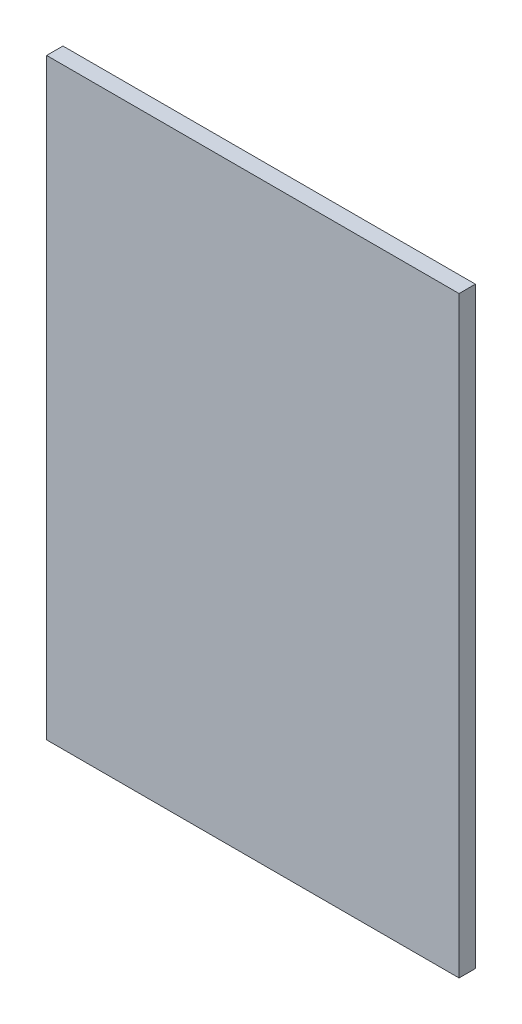
ISO-10303-21;
HEADER;
FILE_DESCRIPTION(('STEP AP214'),'2;1');
FILE_NAME('part.step','',(''),(''),'','','');
FILE_SCHEMA(('AUTOMOTIVE_DESIGN { 1 0 10303 214 1 1 1 1 }'));
ENDSEC;
DATA;
#1=APPLICATION_CONTEXT('core data for automotive mechanical design processes');
#2=APPLICATION_PROTOCOL_DEFINITION('international standard','automotive_design',2000,#1);
#3=PRODUCT_CONTEXT('',#1,'mechanical');
#4=PRODUCT('Part','Part','',(#3));
#5=PRODUCT_RELATED_PRODUCT_CATEGORY('part','',(#4));
#6=PRODUCT_DEFINITION_FORMATION('','',#4);
#7=PRODUCT_DEFINITION_CONTEXT('part definition',#1,'design');
#8=PRODUCT_DEFINITION('design','',#6,#7);
#9=PRODUCT_DEFINITION_SHAPE('','',#8);
#10=(LENGTH_UNIT() NAMED_UNIT(*) SI_UNIT(.MILLI.,.METRE.));
#11=(NAMED_UNIT(*) PLANE_ANGLE_UNIT() SI_UNIT($,.RADIAN.));
#12=(NAMED_UNIT(*) SI_UNIT($,.STERADIAN.) SOLID_ANGLE_UNIT());
#13=UNCERTAINTY_MEASURE_WITH_UNIT(LENGTH_MEASURE(1.E-05),#10,'distance_accuracy_value','');
#14=(GEOMETRIC_REPRESENTATION_CONTEXT(3) GLOBAL_UNCERTAINTY_ASSIGNED_CONTEXT((#13)) GLOBAL_UNIT_ASSIGNED_CONTEXT((#10,
#11,#12)) REPRESENTATION_CONTEXT('',''));
#15=CARTESIAN_POINT('',(0.,0.,0.));
#16=DIRECTION('',(0.,0.,1.));
#17=DIRECTION('',(1.,0.,0.));
#18=AXIS2_PLACEMENT_3D('',#15,#16,#17);
#19=CARTESIAN_POINT('',(215.,309.,17.));
#20=DIRECTION('',(-1.,0.,0.));
#21=DIRECTION('',(0.,0.,1.));
#22=AXIS2_PLACEMENT_3D('',#19,#20,#21);
#23=PLANE('',#22);
#24=DIRECTION('',(0.,1.,0.));
#25=VECTOR('',#24,1.);
#26=CARTESIAN_POINT('',(215.,309.,0.));
#27=LINE('',#26,#25);
#28=CARTESIAN_POINT('',(215.,-309.,0.));
#29=VERTEX_POINT('',#28);
#30=CARTESIAN_POINT('',(215.,309.,0.));
#31=VERTEX_POINT('',#30);
#32=EDGE_CURVE('E80',#29,#31,#27,.T.);
#33=ORIENTED_EDGE('',*,*,#32,.T.);
#34=DIRECTION('',(0.,0.,-1.));
#35=VECTOR('',#34,1.);
#36=CARTESIAN_POINT('',(215.,309.,17.));
#37=LINE('',#36,#35);
#38=CARTESIAN_POINT('',(215.,309.,17.));
#39=VERTEX_POINT('',#38);
#40=EDGE_CURVE('E11',#39,#31,#37,.T.);
#41=ORIENTED_EDGE('',*,*,#40,.F.);
#42=DIRECTION('',(0.,1.,0.));
#43=VECTOR('',#42,1.);
#44=CARTESIAN_POINT('',(215.,309.,17.));
#45=LINE('',#44,#43);
#46=CARTESIAN_POINT('',(215.,-309.,17.));
#47=VERTEX_POINT('',#46);
#48=EDGE_CURVE('E68',#47,#39,#45,.T.);
#49=ORIENTED_EDGE('',*,*,#48,.F.);
#50=DIRECTION('',(0.,0.,-1.));
#51=VECTOR('',#50,1.);
#52=CARTESIAN_POINT('',(215.,-309.,17.));
#53=LINE('',#52,#51);
#54=EDGE_CURVE('E76',#47,#29,#53,.T.);
#55=ORIENTED_EDGE('',*,*,#54,.T.);
#56=EDGE_LOOP('',(#33,#41,#49,#55));
#57=FACE_BOUND('',#56,.T.);
#58=ADVANCED_FACE('F17',(#57),#23,.F.);
#59=CARTESIAN_POINT('',(-215.,309.,17.));
#60=DIRECTION('',(0.,-1.,0.));
#61=DIRECTION('',(0.,0.,-1.));
#62=AXIS2_PLACEMENT_3D('',#59,#60,#61);
#63=PLANE('',#62);
#64=DIRECTION('',(-1.,0.,0.));
#65=VECTOR('',#64,1.);
#66=CARTESIAN_POINT('',(-215.,309.,0.));
#67=LINE('',#66,#65);
#68=CARTESIAN_POINT('',(-215.,309.,0.));
#69=VERTEX_POINT('',#68);
#70=EDGE_CURVE('E72',#31,#69,#67,.T.);
#71=ORIENTED_EDGE('',*,*,#70,.T.);
#72=DIRECTION('',(0.,0.,-1.));
#73=VECTOR('',#72,1.);
#74=CARTESIAN_POINT('',(-215.,309.,17.));
#75=LINE('',#74,#73);
#76=CARTESIAN_POINT('',(-215.,309.,17.));
#77=VERTEX_POINT('',#76);
#78=EDGE_CURVE('E25',#77,#69,#75,.T.);
#79=ORIENTED_EDGE('',*,*,#78,.F.);
#80=DIRECTION('',(-1.,0.,0.));
#81=VECTOR('',#80,1.);
#82=CARTESIAN_POINT('',(-215.,309.,17.));
#83=LINE('',#82,#81);
#84=EDGE_CURVE('E63',#39,#77,#83,.T.);
#85=ORIENTED_EDGE('',*,*,#84,.F.);
#86=ORIENTED_EDGE('',*,*,#40,.T.);
#87=EDGE_LOOP('',(#71,#79,#85,#86));
#88=FACE_BOUND('',#87,.T.);
#89=ADVANCED_FACE('F71',(#88),#63,.F.);
#90=CARTESIAN_POINT('',(-215.,309.,17.));
#91=DIRECTION('',(1.,0.,0.));
#92=DIRECTION('',(0.,0.,-1.));
#93=AXIS2_PLACEMENT_3D('',#90,#91,#92);
#94=PLANE('',#93);
#95=DIRECTION('',(0.,-1.,0.));
#96=VECTOR('',#95,1.);
#97=CARTESIAN_POINT('',(-215.,309.,0.));
#98=LINE('',#97,#96);
#99=CARTESIAN_POINT('',(-215.,-309.,0.));
#100=VERTEX_POINT('',#99);
#101=EDGE_CURVE('E50',#69,#100,#98,.T.);
#102=ORIENTED_EDGE('',*,*,#101,.T.);
#103=DIRECTION('',(0.,0.,-1.));
#104=VECTOR('',#103,1.);
#105=CARTESIAN_POINT('',(-215.,-309.,17.));
#106=LINE('',#105,#104);
#107=CARTESIAN_POINT('',(-215.,-309.,17.));
#108=VERTEX_POINT('',#107);
#109=EDGE_CURVE('E73',#108,#100,#106,.T.);
#110=ORIENTED_EDGE('',*,*,#109,.F.);
#111=DIRECTION('',(0.,-1.,0.));
#112=VECTOR('',#111,1.);
#113=CARTESIAN_POINT('',(-215.,309.,17.));
#114=LINE('',#113,#112);
#115=EDGE_CURVE('E66',#77,#108,#114,.T.);
#116=ORIENTED_EDGE('',*,*,#115,.F.);
#117=ORIENTED_EDGE('',*,*,#78,.T.);
#118=EDGE_LOOP('',(#102,#110,#116,#117));
#119=FACE_BOUND('',#118,.T.);
#120=ADVANCED_FACE('F74',(#119),#94,.F.);
#121=CARTESIAN_POINT('',(-215.,-309.,17.));
#122=DIRECTION('',(0.,1.,0.));
#123=DIRECTION('',(0.,0.,1.));
#124=AXIS2_PLACEMENT_3D('',#121,#122,#123);
#125=PLANE('',#124);
#126=DIRECTION('',(1.,0.,0.));
#127=VECTOR('',#126,1.);
#128=CARTESIAN_POINT('',(-215.,-309.,0.));
#129=LINE('',#128,#127);
#130=EDGE_CURVE('E56',#100,#29,#129,.T.);
#131=ORIENTED_EDGE('',*,*,#130,.T.);
#132=ORIENTED_EDGE('',*,*,#54,.F.);
#133=DIRECTION('',(1.,0.,0.));
#134=VECTOR('',#133,1.);
#135=CARTESIAN_POINT('',(-215.,-309.,17.));
#136=LINE('',#135,#134);
#137=EDGE_CURVE('E33',#108,#47,#136,.T.);
#138=ORIENTED_EDGE('',*,*,#137,.F.);
#139=ORIENTED_EDGE('',*,*,#109,.T.);
#140=EDGE_LOOP('',(#131,#132,#138,#139));
#141=FACE_BOUND('',#140,.T.);
#142=ADVANCED_FACE('F87',(#141),#125,.F.);
#143=CARTESIAN_POINT('',(0.,0.,17.));
#144=DIRECTION('',(0.,0.,1.));
#145=DIRECTION('',(1.,0.,0.));
#146=AXIS2_PLACEMENT_3D('',#143,#144,#145);
#147=PLANE('',#146);
#148=ORIENTED_EDGE('',*,*,#48,.T.);
#149=ORIENTED_EDGE('',*,*,#84,.T.);
#150=ORIENTED_EDGE('',*,*,#115,.T.);
#151=ORIENTED_EDGE('',*,*,#137,.T.);
#152=EDGE_LOOP('',(#148,#149,#150,#151));
#153=FACE_BOUND('',#152,.T.);
#154=ADVANCED_FACE('F64',(#153),#147,.T.);
#155=CARTESIAN_POINT('',(0.,0.,0.));
#156=DIRECTION('',(0.,0.,1.));
#157=DIRECTION('',(1.,0.,0.));
#158=AXIS2_PLACEMENT_3D('',#155,#156,#157);
#159=PLANE('',#158);
#160=ORIENTED_EDGE('',*,*,#32,.F.);
#161=ORIENTED_EDGE('',*,*,#130,.F.);
#162=ORIENTED_EDGE('',*,*,#101,.F.);
#163=ORIENTED_EDGE('',*,*,#70,.F.);
#164=EDGE_LOOP('',(#160,#161,#162,#163));
#165=FACE_BOUND('',#164,.T.);
#166=ADVANCED_FACE('F90',(#165),#159,.F.);
#167=CLOSED_SHELL('',(#58,#89,#120,#142,#154,#166));
#168=MANIFOLD_SOLID_BREP('B1',#167);
#169=ADVANCED_BREP_SHAPE_REPRESENTATION('',(#18,#168),#14);
#170=SHAPE_DEFINITION_REPRESENTATION(#9,#169);
ENDSEC;
END-ISO-10303-21;
